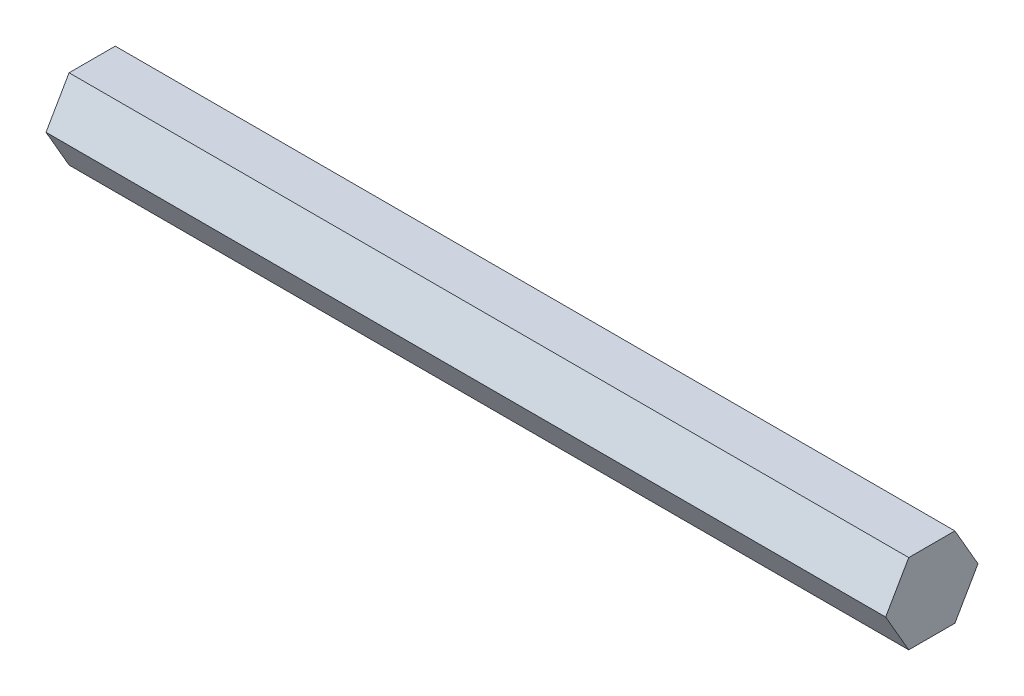
ISO-10303-21;
HEADER;
FILE_DESCRIPTION(('STEP AP214'),'2;1');
FILE_NAME('part.step','',(''),(''),'','','');
FILE_SCHEMA(('AUTOMOTIVE_DESIGN { 1 0 10303 214 1 1 1 1 }'));
ENDSEC;
DATA;
#1=APPLICATION_CONTEXT('core data for automotive mechanical design processes');
#2=APPLICATION_PROTOCOL_DEFINITION('international standard','automotive_design',2000,#1);
#3=PRODUCT_CONTEXT('',#1,'mechanical');
#4=PRODUCT('Part','Part','',(#3));
#5=PRODUCT_RELATED_PRODUCT_CATEGORY('part','',(#4));
#6=PRODUCT_DEFINITION_FORMATION('','',#4);
#7=PRODUCT_DEFINITION_CONTEXT('part definition',#1,'design');
#8=PRODUCT_DEFINITION('design','',#6,#7);
#9=PRODUCT_DEFINITION_SHAPE('','',#8);
#10=(LENGTH_UNIT() NAMED_UNIT(*) SI_UNIT(.MILLI.,.METRE.));
#11=(NAMED_UNIT(*) PLANE_ANGLE_UNIT() SI_UNIT($,.RADIAN.));
#12=(NAMED_UNIT(*) SI_UNIT($,.STERADIAN.) SOLID_ANGLE_UNIT());
#13=UNCERTAINTY_MEASURE_WITH_UNIT(LENGTH_MEASURE(1.E-05),#10,'distance_accuracy_value','');
#14=(GEOMETRIC_REPRESENTATION_CONTEXT(3) GLOBAL_UNCERTAINTY_ASSIGNED_CONTEXT((#13)) GLOBAL_UNIT_ASSIGNED_CONTEXT((#10,
#11,#12)) REPRESENTATION_CONTEXT('',''));
#15=CARTESIAN_POINT('',(0.,0.,0.));
#16=DIRECTION('',(0.,0.,1.));
#17=DIRECTION('',(1.,0.,0.));
#18=AXIS2_PLACEMENT_3D('',#15,#16,#17);
#19=CARTESIAN_POINT('',(133.35,-6.35,-3.66617420935413));
#20=DIRECTION('',(0.,0.5,0.866025403784439));
#21=DIRECTION('',(0.,-0.866025403784439,0.5));
#22=AXIS2_PLACEMENT_3D('',#19,#20,#21);
#23=PLANE('',#22);
#24=DIRECTION('',(0.,0.866025403784439,-0.5));
#25=VECTOR('',#24,1.);
#26=CARTESIAN_POINT('',(0.,-6.35,-3.66617420935413));
#27=LINE('',#26,#25);
#28=CARTESIAN_POINT('',(0.,-6.35,-3.66617420935413));
#29=VERTEX_POINT('',#28);
#30=CARTESIAN_POINT('',(0.,0.,-7.33234841870825));
#31=VERTEX_POINT('',#30);
#32=EDGE_CURVE('E127',#29,#31,#27,.T.);
#33=ORIENTED_EDGE('',*,*,#32,.T.);
#34=DIRECTION('',(-1.,0.,0.));
#35=VECTOR('',#34,1.);
#36=CARTESIAN_POINT('',(133.35,0.,-7.33234841870825));
#37=LINE('',#36,#35);
#38=CARTESIAN_POINT('',(133.35,0.,-7.33234841870825));
#39=VERTEX_POINT('',#38);
#40=EDGE_CURVE('E11',#39,#31,#37,.T.);
#41=ORIENTED_EDGE('',*,*,#40,.F.);
#42=DIRECTION('',(0.,0.866025403784439,-0.5));
#43=VECTOR('',#42,1.);
#44=CARTESIAN_POINT('',(133.35,-6.35,-3.66617420935413));
#45=LINE('',#44,#43);
#46=CARTESIAN_POINT('',(133.35,-6.35,-3.66617420935413));
#47=VERTEX_POINT('',#46);
#48=EDGE_CURVE('E137',#47,#39,#45,.T.);
#49=ORIENTED_EDGE('',*,*,#48,.F.);
#50=DIRECTION('',(-1.,0.,0.));
#51=VECTOR('',#50,1.);
#52=CARTESIAN_POINT('',(133.35,-6.35,-3.66617420935413));
#53=LINE('',#52,#51);
#54=EDGE_CURVE('E123',#47,#29,#53,.T.);
#55=ORIENTED_EDGE('',*,*,#54,.T.);
#56=EDGE_LOOP('',(#33,#41,#49,#55));
#57=FACE_BOUND('',#56,.T.);
#58=ADVANCED_FACE('F41',(#57),#23,.F.);
#59=CARTESIAN_POINT('',(133.35,0.,-7.33234841870825));
#60=DIRECTION('',(0.,-0.5,0.866025403784439));
#61=DIRECTION('',(0.,-0.866025403784439,-0.5));
#62=AXIS2_PLACEMENT_3D('',#59,#60,#61);
#63=PLANE('',#62);
#64=DIRECTION('',(0.,0.866025403784439,0.5));
#65=VECTOR('',#64,1.);
#66=CARTESIAN_POINT('',(0.,0.,-7.33234841870825));
#67=LINE('',#66,#65);
#68=CARTESIAN_POINT('',(0.,6.35,-3.66617420935412));
#69=VERTEX_POINT('',#68);
#70=EDGE_CURVE('E130',#31,#69,#67,.T.);
#71=ORIENTED_EDGE('',*,*,#70,.T.);
#72=DIRECTION('',(-1.,0.,0.));
#73=VECTOR('',#72,1.);
#74=CARTESIAN_POINT('',(133.35,6.35,-3.66617420935412));
#75=LINE('',#74,#73);
#76=CARTESIAN_POINT('',(133.35,6.35,-3.66617420935412));
#77=VERTEX_POINT('',#76);
#78=EDGE_CURVE('E50',#77,#69,#75,.T.);
#79=ORIENTED_EDGE('',*,*,#78,.F.);
#80=DIRECTION('',(0.,0.866025403784439,0.5));
#81=VECTOR('',#80,1.);
#82=CARTESIAN_POINT('',(133.35,0.,-7.33234841870825));
#83=LINE('',#82,#81);
#84=EDGE_CURVE('E95',#39,#77,#83,.T.);
#85=ORIENTED_EDGE('',*,*,#84,.F.);
#86=ORIENTED_EDGE('',*,*,#40,.T.);
#87=EDGE_LOOP('',(#71,#79,#85,#86));
#88=FACE_BOUND('',#87,.T.);
#89=ADVANCED_FACE('F165',(#88),#63,.F.);
#90=CARTESIAN_POINT('',(133.35,6.35,-3.66617420935412));
#91=DIRECTION('',(0.,-1.,0.));
#92=DIRECTION('',(0.,0.,-1.));
#93=AXIS2_PLACEMENT_3D('',#90,#91,#92);
#94=PLANE('',#93);
#95=DIRECTION('',(0.,0.,1.));
#96=VECTOR('',#95,1.);
#97=CARTESIAN_POINT('',(0.,6.35,-3.66617420935412));
#98=LINE('',#97,#96);
#99=CARTESIAN_POINT('',(0.,6.35,3.66617420935412));
#100=VERTEX_POINT('',#99);
#101=EDGE_CURVE('E132',#69,#100,#98,.T.);
#102=ORIENTED_EDGE('',*,*,#101,.T.);
#103=DIRECTION('',(-1.,0.,0.));
#104=VECTOR('',#103,1.);
#105=CARTESIAN_POINT('',(133.35,6.35,3.66617420935412));
#106=LINE('',#105,#104);
#107=CARTESIAN_POINT('',(133.35,6.35,3.66617420935412));
#108=VERTEX_POINT('',#107);
#109=EDGE_CURVE('E118',#108,#100,#106,.T.);
#110=ORIENTED_EDGE('',*,*,#109,.F.);
#111=DIRECTION('',(0.,0.,1.));
#112=VECTOR('',#111,1.);
#113=CARTESIAN_POINT('',(133.35,6.35,-3.66617420935412));
#114=LINE('',#113,#112);
#115=EDGE_CURVE('E108',#77,#108,#114,.T.);
#116=ORIENTED_EDGE('',*,*,#115,.F.);
#117=ORIENTED_EDGE('',*,*,#78,.T.);
#118=EDGE_LOOP('',(#102,#110,#116,#117));
#119=FACE_BOUND('',#118,.T.);
#120=ADVANCED_FACE('F147',(#119),#94,.F.);
#121=CARTESIAN_POINT('',(133.35,6.35,3.66617420935412));
#122=DIRECTION('',(0.,-0.5,-0.866025403784439));
#123=DIRECTION('',(0.,0.866025403784439,-0.5));
#124=AXIS2_PLACEMENT_3D('',#121,#122,#123);
#125=PLANE('',#124);
#126=DIRECTION('',(0.,-0.866025403784439,0.5));
#127=VECTOR('',#126,1.);
#128=CARTESIAN_POINT('',(0.,6.35,3.66617420935412));
#129=LINE('',#128,#127);
#130=CARTESIAN_POINT('',(0.,0.,7.33234841870825));
#131=VERTEX_POINT('',#130);
#132=EDGE_CURVE('E116',#100,#131,#129,.T.);
#133=ORIENTED_EDGE('',*,*,#132,.T.);
#134=DIRECTION('',(-1.,0.,0.));
#135=VECTOR('',#134,1.);
#136=CARTESIAN_POINT('',(133.35,0.,7.33234841870825));
#137=LINE('',#136,#135);
#138=CARTESIAN_POINT('',(133.35,0.,7.33234841870825));
#139=VERTEX_POINT('',#138);
#140=EDGE_CURVE('E113',#139,#131,#137,.T.);
#141=ORIENTED_EDGE('',*,*,#140,.F.);
#142=DIRECTION('',(0.,-0.866025403784439,0.5));
#143=VECTOR('',#142,1.);
#144=CARTESIAN_POINT('',(133.35,6.35,3.66617420935412));
#145=LINE('',#144,#143);
#146=EDGE_CURVE('E102',#108,#139,#145,.T.);
#147=ORIENTED_EDGE('',*,*,#146,.F.);
#148=ORIENTED_EDGE('',*,*,#109,.T.);
#149=EDGE_LOOP('',(#133,#141,#147,#148));
#150=FACE_BOUND('',#149,.T.);
#151=ADVANCED_FACE('F114',(#150),#125,.F.);
#152=CARTESIAN_POINT('',(133.35,0.,7.33234841870825));
#153=DIRECTION('',(0.,0.5,-0.866025403784439));
#154=DIRECTION('',(0.,0.866025403784439,0.5));
#155=AXIS2_PLACEMENT_3D('',#152,#153,#154);
#156=PLANE('',#155);
#157=DIRECTION('',(0.,-0.866025403784439,-0.5));
#158=VECTOR('',#157,1.);
#159=CARTESIAN_POINT('',(0.,0.,7.33234841870825));
#160=LINE('',#159,#158);
#161=CARTESIAN_POINT('',(0.,-6.35,3.66617420935412));
#162=VERTEX_POINT('',#161);
#163=EDGE_CURVE('E81',#131,#162,#160,.T.);
#164=ORIENTED_EDGE('',*,*,#163,.T.);
#165=DIRECTION('',(-1.,0.,0.));
#166=VECTOR('',#165,1.);
#167=CARTESIAN_POINT('',(133.35,-6.35,3.66617420935412));
#168=LINE('',#167,#166);
#169=CARTESIAN_POINT('',(133.35,-6.35,3.66617420935412));
#170=VERTEX_POINT('',#169);
#171=EDGE_CURVE('E119',#170,#162,#168,.T.);
#172=ORIENTED_EDGE('',*,*,#171,.F.);
#173=DIRECTION('',(0.,-0.866025403784439,-0.5));
#174=VECTOR('',#173,1.);
#175=CARTESIAN_POINT('',(133.35,0.,7.33234841870825));
#176=LINE('',#175,#174);
#177=EDGE_CURVE('E106',#139,#170,#176,.T.);
#178=ORIENTED_EDGE('',*,*,#177,.F.);
#179=ORIENTED_EDGE('',*,*,#140,.T.);
#180=EDGE_LOOP('',(#164,#172,#178,#179));
#181=FACE_BOUND('',#180,.T.);
#182=ADVANCED_FACE('F121',(#181),#156,.F.);
#183=CARTESIAN_POINT('',(133.35,-6.35,3.66617420935412));
#184=DIRECTION('',(0.,1.,0.));
#185=DIRECTION('',(0.,0.,1.));
#186=AXIS2_PLACEMENT_3D('',#183,#184,#185);
#187=PLANE('',#186);
#188=DIRECTION('',(0.,0.,-1.));
#189=VECTOR('',#188,1.);
#190=CARTESIAN_POINT('',(0.,-6.35,3.66617420935412));
#191=LINE('',#190,#189);
#192=EDGE_CURVE('E87',#162,#29,#191,.T.);
#193=ORIENTED_EDGE('',*,*,#192,.T.);
#194=ORIENTED_EDGE('',*,*,#54,.F.);
#195=DIRECTION('',(0.,0.,-1.));
#196=VECTOR('',#195,1.);
#197=CARTESIAN_POINT('',(133.35,-6.35,3.66617420935412));
#198=LINE('',#197,#196);
#199=EDGE_CURVE('E58',#170,#47,#198,.T.);
#200=ORIENTED_EDGE('',*,*,#199,.F.);
#201=ORIENTED_EDGE('',*,*,#171,.T.);
#202=EDGE_LOOP('',(#193,#194,#200,#201));
#203=FACE_BOUND('',#202,.T.);
#204=ADVANCED_FACE('F154',(#203),#187,.F.);
#205=CARTESIAN_POINT('',(133.35,0.,0.));
#206=DIRECTION('',(1.,0.,0.));
#207=DIRECTION('',(0.,0.,-1.));
#208=AXIS2_PLACEMENT_3D('',#205,#206,#207);
#209=PLANE('',#208);
#210=ORIENTED_EDGE('',*,*,#48,.T.);
#211=ORIENTED_EDGE('',*,*,#84,.T.);
#212=ORIENTED_EDGE('',*,*,#115,.T.);
#213=ORIENTED_EDGE('',*,*,#146,.T.);
#214=ORIENTED_EDGE('',*,*,#177,.T.);
#215=ORIENTED_EDGE('',*,*,#199,.T.);
#216=EDGE_LOOP('',(#210,#211,#212,#213,#214,#215));
#217=FACE_BOUND('',#216,.T.);
#218=ADVANCED_FACE('F104',(#217),#209,.T.);
#219=CARTESIAN_POINT('',(0.,0.,0.));
#220=DIRECTION('',(1.,0.,0.));
#221=DIRECTION('',(0.,0.,-1.));
#222=AXIS2_PLACEMENT_3D('',#219,#220,#221);
#223=PLANE('',#222);
#224=ORIENTED_EDGE('',*,*,#32,.F.);
#225=ORIENTED_EDGE('',*,*,#192,.F.);
#226=ORIENTED_EDGE('',*,*,#163,.F.);
#227=ORIENTED_EDGE('',*,*,#132,.F.);
#228=ORIENTED_EDGE('',*,*,#101,.F.);
#229=ORIENTED_EDGE('',*,*,#70,.F.);
#230=EDGE_LOOP('',(#224,#225,#226,#227,#228,#229));
#231=FACE_BOUND('',#230,.T.);
#232=ADVANCED_FACE('F150',(#231),#223,.F.);
#233=CLOSED_SHELL('',(#58,#89,#120,#151,#182,#204,#218,#232));
#234=MANIFOLD_SOLID_BREP('B2',#233);
#235=ADVANCED_BREP_SHAPE_REPRESENTATION('',(#18,#234),#14);
#236=SHAPE_DEFINITION_REPRESENTATION(#9,#235);
ENDSEC;
END-ISO-10303-21;
